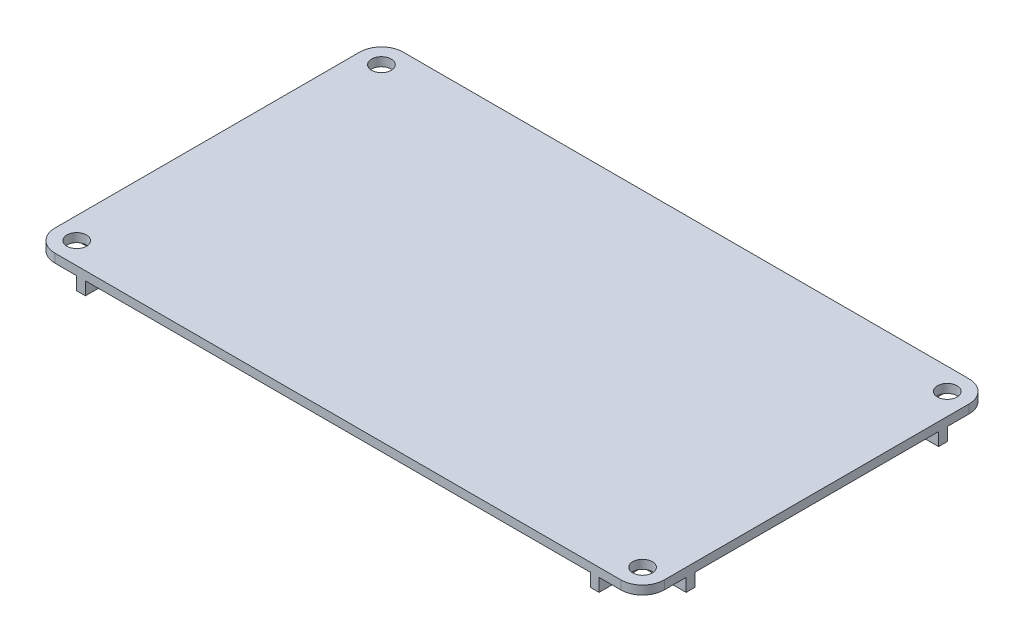
ISO-10303-21;
HEADER;
FILE_DESCRIPTION(('STEP AP214'),'2;1');
FILE_NAME('part.step','',(''),(''),'','','');
FILE_SCHEMA(('AUTOMOTIVE_DESIGN { 1 0 10303 214 1 1 1 1 }'));
ENDSEC;
DATA;
#1=APPLICATION_CONTEXT('core data for automotive mechanical design processes');
#2=APPLICATION_PROTOCOL_DEFINITION('international standard','automotive_design',2000,#1);
#3=PRODUCT_CONTEXT('',#1,'mechanical');
#4=PRODUCT('Part','Part','',(#3));
#5=PRODUCT_RELATED_PRODUCT_CATEGORY('part','',(#4));
#6=PRODUCT_DEFINITION_FORMATION('','',#4);
#7=PRODUCT_DEFINITION_CONTEXT('part definition',#1,'design');
#8=PRODUCT_DEFINITION('design','',#6,#7);
#9=PRODUCT_DEFINITION_SHAPE('','',#8);
#10=(LENGTH_UNIT() NAMED_UNIT(*) SI_UNIT(.MILLI.,.METRE.));
#11=(NAMED_UNIT(*) PLANE_ANGLE_UNIT() SI_UNIT($,.RADIAN.));
#12=(NAMED_UNIT(*) SI_UNIT($,.STERADIAN.) SOLID_ANGLE_UNIT());
#13=UNCERTAINTY_MEASURE_WITH_UNIT(LENGTH_MEASURE(1.E-05),#10,'distance_accuracy_value','');
#14=(GEOMETRIC_REPRESENTATION_CONTEXT(3) GLOBAL_UNCERTAINTY_ASSIGNED_CONTEXT((#13)) GLOBAL_UNIT_ASSIGNED_CONTEXT((#10,
#11,#12)) REPRESENTATION_CONTEXT('',''));
#15=CARTESIAN_POINT('',(0.,0.,0.));
#16=DIRECTION('',(0.,0.,1.));
#17=DIRECTION('',(1.,0.,0.));
#18=AXIS2_PLACEMENT_3D('',#15,#16,#17);
#19=CARTESIAN_POINT('',(0.,0.,0.));
#20=DIRECTION('',(0.,1.,0.));
#21=DIRECTION('',(0.,0.,1.));
#22=AXIS2_PLACEMENT_3D('',#19,#20,#21);
#23=PLANE('',#22);
#24=CARTESIAN_POINT('',(-65.,0.,-35.));
#25=DIRECTION('',(0.,1.,0.));
#26=DIRECTION('',(0.,0.,1.));
#27=AXIS2_PLACEMENT_3D('',#24,#25,#26);
#28=CIRCLE('',#27,2.25);
#29=CARTESIAN_POINT('',(-65.,0.,-32.75));
#30=VERTEX_POINT('',#29);
#31=EDGE_CURVE('E467',#30,#30,#28,.F.);
#32=ORIENTED_EDGE('',*,*,#31,.F.);
#33=EDGE_LOOP('',(#32));
#34=FACE_BOUND('',#33,.T.);
#35=DIRECTION('',(0.,0.,1.));
#36=VECTOR('',#35,1.);
#37=CARTESIAN_POINT('',(-70.,0.,0.));
#38=LINE('',#37,#36);
#39=CARTESIAN_POINT('',(-70.,0.,-35.));
#40=VERTEX_POINT('',#39);
#41=CARTESIAN_POINT('',(-70.,0.,-30.));
#42=VERTEX_POINT('',#41);
#43=EDGE_CURVE('E252',#40,#42,#38,.T.);
#44=ORIENTED_EDGE('',*,*,#43,.F.);
#45=CARTESIAN_POINT('',(-65.,0.,-35.));
#46=DIRECTION('',(0.,1.,0.));
#47=DIRECTION('',(0.,0.,1.));
#48=AXIS2_PLACEMENT_3D('',#45,#46,#47);
#49=CIRCLE('',#48,5.);
#50=CARTESIAN_POINT('',(-65.,0.,-40.));
#51=VERTEX_POINT('',#50);
#52=EDGE_CURVE('E498',#40,#51,#49,.F.);
#53=ORIENTED_EDGE('',*,*,#52,.T.);
#54=DIRECTION('',(1.,0.,0.));
#55=VECTOR('',#54,1.);
#56=CARTESIAN_POINT('',(0.,0.,-40.));
#57=LINE('',#56,#55);
#58=CARTESIAN_POINT('',(-60.,0.,-40.));
#59=VERTEX_POINT('',#58);
#60=EDGE_CURVE('E454',#51,#59,#57,.T.);
#61=ORIENTED_EDGE('',*,*,#60,.T.);
#62=DIRECTION('',(0.,0.,-1.));
#63=VECTOR('',#62,1.);
#64=CARTESIAN_POINT('',(-60.,0.,0.));
#65=LINE('',#64,#63);
#66=CARTESIAN_POINT('',(-60.,0.,-30.));
#67=VERTEX_POINT('',#66);
#68=EDGE_CURVE('E265',#67,#59,#65,.T.);
#69=ORIENTED_EDGE('',*,*,#68,.F.);
#70=DIRECTION('',(1.,0.,0.));
#71=VECTOR('',#70,1.);
#72=CARTESIAN_POINT('',(0.,0.,-30.));
#73=LINE('',#72,#71);
#74=EDGE_CURVE('E279',#42,#67,#73,.T.);
#75=ORIENTED_EDGE('',*,*,#74,.F.);
#76=EDGE_LOOP('',(#44,#53,#61,#69,#75));
#77=FACE_BOUND('',#76,.T.);
#78=ADVANCED_FACE('F35',(#34,#77),#23,.F.);
#79=DIRECTION('',(0.,0.,1.));
#80=VECTOR('',#79,1.);
#81=CARTESIAN_POINT('',(-58.,0.,0.));
#82=LINE('',#81,#80);
#83=CARTESIAN_POINT('',(-58.,0.,-40.));
#84=VERTEX_POINT('',#83);
#85=CARTESIAN_POINT('',(-58.,0.,-28.));
#86=VERTEX_POINT('',#85);
#87=EDGE_CURVE('E283',#84,#86,#82,.T.);
#88=ORIENTED_EDGE('',*,*,#87,.F.);
#89=CARTESIAN_POINT('',(58.,0.,-40.));
#90=VERTEX_POINT('',#89);
#91=EDGE_CURVE('E457',#84,#90,#57,.T.);
#92=ORIENTED_EDGE('',*,*,#91,.T.);
#93=DIRECTION('',(0.,0.,1.));
#94=VECTOR('',#93,1.);
#95=CARTESIAN_POINT('',(58.,0.,0.));
#96=LINE('',#95,#94);
#97=CARTESIAN_POINT('',(58.,0.,-28.));
#98=VERTEX_POINT('',#97);
#99=EDGE_CURVE('E288',#90,#98,#96,.T.);
#100=ORIENTED_EDGE('',*,*,#99,.T.);
#101=DIRECTION('',(1.,0.,0.));
#102=VECTOR('',#101,1.);
#103=CARTESIAN_POINT('',(0.,0.,-28.));
#104=LINE('',#103,#102);
#105=CARTESIAN_POINT('',(70.,0.,-28.));
#106=VERTEX_POINT('',#105);
#107=EDGE_CURVE('E317',#98,#106,#104,.T.);
#108=ORIENTED_EDGE('',*,*,#107,.T.);
#109=DIRECTION('',(0.,0.,1.));
#110=VECTOR('',#109,1.);
#111=CARTESIAN_POINT('',(70.,0.,0.));
#112=LINE('',#111,#110);
#113=CARTESIAN_POINT('',(70.,0.,28.));
#114=VERTEX_POINT('',#113);
#115=EDGE_CURVE('E453',#106,#114,#112,.T.);
#116=ORIENTED_EDGE('',*,*,#115,.T.);
#117=DIRECTION('',(1.,0.,0.));
#118=VECTOR('',#117,1.);
#119=CARTESIAN_POINT('',(0.,0.,28.));
#120=LINE('',#119,#118);
#121=CARTESIAN_POINT('',(58.,0.,28.));
#122=VERTEX_POINT('',#121);
#123=EDGE_CURVE('E359',#122,#114,#120,.T.);
#124=ORIENTED_EDGE('',*,*,#123,.F.);
#125=DIRECTION('',(0.,0.,-1.));
#126=VECTOR('',#125,1.);
#127=CARTESIAN_POINT('',(58.,0.,0.));
#128=LINE('',#127,#126);
#129=CARTESIAN_POINT('',(58.,0.,40.));
#130=VERTEX_POINT('',#129);
#131=EDGE_CURVE('E362',#130,#122,#128,.T.);
#132=ORIENTED_EDGE('',*,*,#131,.F.);
#133=DIRECTION('',(1.,0.,0.));
#134=VECTOR('',#133,1.);
#135=CARTESIAN_POINT('',(0.,0.,40.));
#136=LINE('',#135,#134);
#137=CARTESIAN_POINT('',(-58.,0.,40.));
#138=VERTEX_POINT('',#137);
#139=EDGE_CURVE('E464',#138,#130,#136,.T.);
#140=ORIENTED_EDGE('',*,*,#139,.F.);
#141=DIRECTION('',(0.,0.,-1.));
#142=VECTOR('',#141,1.);
#143=CARTESIAN_POINT('',(-58.,0.,0.));
#144=LINE('',#143,#142);
#145=CARTESIAN_POINT('',(-58.,0.,28.));
#146=VERTEX_POINT('',#145);
#147=EDGE_CURVE('E367',#138,#146,#144,.T.);
#148=ORIENTED_EDGE('',*,*,#147,.T.);
#149=DIRECTION('',(-1.,0.,0.));
#150=VECTOR('',#149,1.);
#151=CARTESIAN_POINT('',(0.,0.,28.));
#152=LINE('',#151,#150);
#153=CARTESIAN_POINT('',(-70.,0.,28.));
#154=VERTEX_POINT('',#153);
#155=EDGE_CURVE('E402',#146,#154,#152,.T.);
#156=ORIENTED_EDGE('',*,*,#155,.T.);
#157=CARTESIAN_POINT('',(-70.,0.,-28.));
#158=VERTEX_POINT('',#157);
#159=EDGE_CURVE('E460',#158,#154,#38,.T.);
#160=ORIENTED_EDGE('',*,*,#159,.F.);
#161=DIRECTION('',(-1.,0.,0.));
#162=VECTOR('',#161,1.);
#163=CARTESIAN_POINT('',(0.,0.,-28.));
#164=LINE('',#163,#162);
#165=EDGE_CURVE('E281',#86,#158,#164,.T.);
#166=ORIENTED_EDGE('',*,*,#165,.F.);
#167=EDGE_LOOP('',(#88,#92,#100,#108,#116,#124,#132,#140,#148,#156,#160,#166));
#168=FACE_BOUND('',#167,.T.);
#169=ADVANCED_FACE('F560',(#168),#23,.F.);
#170=CARTESIAN_POINT('',(65.,0.,-35.));
#171=DIRECTION('',(0.,1.,0.));
#172=DIRECTION('',(0.,0.,1.));
#173=AXIS2_PLACEMENT_3D('',#170,#171,#172);
#174=CIRCLE('',#173,2.25);
#175=CARTESIAN_POINT('',(65.,0.,-32.75));
#176=VERTEX_POINT('',#175);
#177=EDGE_CURVE('E470',#176,#176,#174,.T.);
#178=ORIENTED_EDGE('',*,*,#177,.T.);
#179=EDGE_LOOP('',(#178));
#180=FACE_BOUND('',#179,.T.);
#181=CARTESIAN_POINT('',(60.,0.,-40.));
#182=VERTEX_POINT('',#181);
#183=CARTESIAN_POINT('',(65.,0.,-40.));
#184=VERTEX_POINT('',#183);
#185=EDGE_CURVE('E452',#182,#184,#57,.T.);
#186=ORIENTED_EDGE('',*,*,#185,.T.);
#187=CARTESIAN_POINT('',(65.,0.,-35.));
#188=DIRECTION('',(0.,1.,0.));
#189=DIRECTION('',(0.,0.,1.));
#190=AXIS2_PLACEMENT_3D('',#187,#188,#189);
#191=CIRCLE('',#190,5.);
#192=CARTESIAN_POINT('',(70.,0.,-35.));
#193=VERTEX_POINT('',#192);
#194=EDGE_CURVE('E479',#184,#193,#191,.F.);
#195=ORIENTED_EDGE('',*,*,#194,.T.);
#196=CARTESIAN_POINT('',(70.,0.,-30.));
#197=VERTEX_POINT('',#196);
#198=EDGE_CURVE('E450',#193,#197,#112,.T.);
#199=ORIENTED_EDGE('',*,*,#198,.T.);
#200=DIRECTION('',(-1.,0.,0.));
#201=VECTOR('',#200,1.);
#202=CARTESIAN_POINT('',(0.,0.,-30.));
#203=LINE('',#202,#201);
#204=CARTESIAN_POINT('',(60.,0.,-30.));
#205=VERTEX_POINT('',#204);
#206=EDGE_CURVE('E319',#197,#205,#203,.T.);
#207=ORIENTED_EDGE('',*,*,#206,.T.);
#208=DIRECTION('',(0.,0.,-1.));
#209=VECTOR('',#208,1.);
#210=CARTESIAN_POINT('',(60.,0.,0.));
#211=LINE('',#210,#209);
#212=EDGE_CURVE('E302',#205,#182,#211,.T.);
#213=ORIENTED_EDGE('',*,*,#212,.T.);
#214=EDGE_LOOP('',(#186,#195,#199,#207,#213));
#215=FACE_BOUND('',#214,.T.);
#216=ADVANCED_FACE('F625',(#180,#215),#23,.F.);
#217=CARTESIAN_POINT('',(65.,0.,35.));
#218=DIRECTION('',(0.,1.,0.));
#219=DIRECTION('',(0.,0.,1.));
#220=AXIS2_PLACEMENT_3D('',#217,#218,#219);
#221=CIRCLE('',#220,2.25);
#222=CARTESIAN_POINT('',(65.,0.,37.25));
#223=VERTEX_POINT('',#222);
#224=EDGE_CURVE('E428',#223,#223,#221,.F.);
#225=ORIENTED_EDGE('',*,*,#224,.F.);
#226=EDGE_LOOP('',(#225));
#227=FACE_BOUND('',#226,.T.);
#228=CARTESIAN_POINT('',(70.,0.,30.));
#229=VERTEX_POINT('',#228);
#230=CARTESIAN_POINT('',(70.,0.,35.));
#231=VERTEX_POINT('',#230);
#232=EDGE_CURVE('E412',#229,#231,#112,.T.);
#233=ORIENTED_EDGE('',*,*,#232,.T.);
#234=CARTESIAN_POINT('',(65.,0.,35.));
#235=DIRECTION('',(0.,1.,0.));
#236=DIRECTION('',(0.,0.,1.));
#237=AXIS2_PLACEMENT_3D('',#234,#235,#236);
#238=CIRCLE('',#237,5.);
#239=CARTESIAN_POINT('',(65.,0.,40.));
#240=VERTEX_POINT('',#239);
#241=EDGE_CURVE('E11',#231,#240,#238,.F.);
#242=ORIENTED_EDGE('',*,*,#241,.T.);
#243=CARTESIAN_POINT('',(60.,0.,40.));
#244=VERTEX_POINT('',#243);
#245=EDGE_CURVE('E459',#244,#240,#136,.T.);
#246=ORIENTED_EDGE('',*,*,#245,.F.);
#247=DIRECTION('',(0.,0.,1.));
#248=VECTOR('',#247,1.);
#249=CARTESIAN_POINT('',(60.,0.,0.));
#250=LINE('',#249,#248);
#251=CARTESIAN_POINT('',(60.,0.,30.));
#252=VERTEX_POINT('',#251);
#253=EDGE_CURVE('E345',#252,#244,#250,.T.);
#254=ORIENTED_EDGE('',*,*,#253,.F.);
#255=DIRECTION('',(-1.,0.,0.));
#256=VECTOR('',#255,1.);
#257=CARTESIAN_POINT('',(0.,0.,30.));
#258=LINE('',#257,#256);
#259=EDGE_CURVE('E326',#229,#252,#258,.T.);
#260=ORIENTED_EDGE('',*,*,#259,.F.);
#261=EDGE_LOOP('',(#233,#242,#246,#254,#260));
#262=FACE_BOUND('',#261,.T.);
#263=ADVANCED_FACE('F598',(#227,#262),#23,.F.);
#264=CARTESIAN_POINT('',(70.,2.,0.));
#265=DIRECTION('',(1.,0.,0.));
#266=DIRECTION('',(0.,0.,-1.));
#267=AXIS2_PLACEMENT_3D('',#264,#265,#266);
#268=PLANE('',#267);
#269=ORIENTED_EDGE('',*,*,#198,.F.);
#270=DIRECTION('',(0.,-1.,0.));
#271=VECTOR('',#270,1.);
#272=CARTESIAN_POINT('',(70.,2.,-35.));
#273=LINE('',#272,#271);
#274=CARTESIAN_POINT('',(70.,2.,-35.));
#275=VERTEX_POINT('',#274);
#276=EDGE_CURVE('E484',#193,#275,#273,.F.);
#277=ORIENTED_EDGE('',*,*,#276,.T.);
#278=DIRECTION('',(0.,0.,1.));
#279=VECTOR('',#278,1.);
#280=CARTESIAN_POINT('',(70.,2.,0.));
#281=LINE('',#280,#279);
#282=CARTESIAN_POINT('',(70.,2.,35.));
#283=VERTEX_POINT('',#282);
#284=EDGE_CURVE('E424',#275,#283,#281,.T.);
#285=ORIENTED_EDGE('',*,*,#284,.T.);
#286=DIRECTION('',(0.,-1.,0.));
#287=VECTOR('',#286,1.);
#288=CARTESIAN_POINT('',(70.,0.,35.));
#289=LINE('',#288,#287);
#290=EDGE_CURVE('E481',#283,#231,#289,.T.);
#291=ORIENTED_EDGE('',*,*,#290,.T.);
#292=ORIENTED_EDGE('',*,*,#232,.F.);
#293=DIRECTION('',(0.,1.,0.));
#294=VECTOR('',#293,1.);
#295=CARTESIAN_POINT('',(70.,-3.,30.));
#296=LINE('',#295,#294);
#297=CARTESIAN_POINT('',(70.,-3.,30.));
#298=VERTEX_POINT('',#297);
#299=EDGE_CURVE('E356',#298,#229,#296,.T.);
#300=ORIENTED_EDGE('',*,*,#299,.F.);
#301=DIRECTION('',(0.,0.,1.));
#302=VECTOR('',#301,1.);
#303=CARTESIAN_POINT('',(70.,-3.,0.));
#304=LINE('',#303,#302);
#305=CARTESIAN_POINT('',(70.,-3.,28.));
#306=VERTEX_POINT('',#305);
#307=EDGE_CURVE('E344',#306,#298,#304,.T.);
#308=ORIENTED_EDGE('',*,*,#307,.F.);
#309=DIRECTION('',(0.,1.,0.));
#310=VECTOR('',#309,1.);
#311=CARTESIAN_POINT('',(70.,-3.,28.));
#312=LINE('',#311,#310);
#313=EDGE_CURVE('E376',#306,#114,#312,.T.);
#314=ORIENTED_EDGE('',*,*,#313,.T.);
#315=ORIENTED_EDGE('',*,*,#115,.F.);
#316=DIRECTION('',(0.,1.,0.));
#317=VECTOR('',#316,1.);
#318=CARTESIAN_POINT('',(70.,-3.,-28.));
#319=LINE('',#318,#317);
#320=CARTESIAN_POINT('',(70.,-3.,-28.));
#321=VERTEX_POINT('',#320);
#322=EDGE_CURVE('E336',#321,#106,#319,.T.);
#323=ORIENTED_EDGE('',*,*,#322,.F.);
#324=DIRECTION('',(0.,0.,1.));
#325=VECTOR('',#324,1.);
#326=CARTESIAN_POINT('',(70.,-3.,0.));
#327=LINE('',#326,#325);
#328=CARTESIAN_POINT('',(70.,-3.,-30.));
#329=VERTEX_POINT('',#328);
#330=EDGE_CURVE('E305',#329,#321,#327,.T.);
#331=ORIENTED_EDGE('',*,*,#330,.F.);
#332=DIRECTION('',(0.,1.,0.));
#333=VECTOR('',#332,1.);
#334=CARTESIAN_POINT('',(70.,-3.,-30.));
#335=LINE('',#334,#333);
#336=EDGE_CURVE('E333',#329,#197,#335,.T.);
#337=ORIENTED_EDGE('',*,*,#336,.T.);
#338=EDGE_LOOP('',(#269,#277,#285,#291,#292,#300,#308,#314,#315,#323,#331,#337));
#339=FACE_BOUND('',#338,.T.);
#340=ADVANCED_FACE('F526',(#339),#268,.T.);
#341=CARTESIAN_POINT('',(0.,2.,-40.));
#342=DIRECTION('',(0.,0.,-1.));
#343=DIRECTION('',(-1.,0.,0.));
#344=AXIS2_PLACEMENT_3D('',#341,#342,#343);
#345=PLANE('',#344);
#346=DIRECTION('',(1.,0.,0.));
#347=VECTOR('',#346,1.);
#348=CARTESIAN_POINT('',(0.,2.,-40.));
#349=LINE('',#348,#347);
#350=CARTESIAN_POINT('',(-65.,2.,-40.));
#351=VERTEX_POINT('',#350);
#352=CARTESIAN_POINT('',(65.,2.,-40.));
#353=VERTEX_POINT('',#352);
#354=EDGE_CURVE('E427',#351,#353,#349,.T.);
#355=ORIENTED_EDGE('',*,*,#354,.T.);
#356=DIRECTION('',(0.,-1.,0.));
#357=VECTOR('',#356,1.);
#358=CARTESIAN_POINT('',(65.,2.,-40.));
#359=LINE('',#358,#357);
#360=EDGE_CURVE('E476',#353,#184,#359,.T.);
#361=ORIENTED_EDGE('',*,*,#360,.T.);
#362=ORIENTED_EDGE('',*,*,#185,.F.);
#363=DIRECTION('',(0.,1.,0.));
#364=VECTOR('',#363,1.);
#365=CARTESIAN_POINT('',(60.,-3.,-40.));
#366=LINE('',#365,#364);
#367=CARTESIAN_POINT('',(60.,-3.,-40.));
#368=VERTEX_POINT('',#367);
#369=EDGE_CURVE('E327',#368,#182,#366,.T.);
#370=ORIENTED_EDGE('',*,*,#369,.F.);
#371=DIRECTION('',(1.,0.,0.));
#372=VECTOR('',#371,1.);
#373=CARTESIAN_POINT('',(0.,-3.,-40.));
#374=LINE('',#373,#372);
#375=CARTESIAN_POINT('',(58.,-3.,-40.));
#376=VERTEX_POINT('',#375);
#377=EDGE_CURVE('E313',#376,#368,#374,.T.);
#378=ORIENTED_EDGE('',*,*,#377,.F.);
#379=DIRECTION('',(0.,1.,0.));
#380=VECTOR('',#379,1.);
#381=CARTESIAN_POINT('',(58.,-3.,-40.));
#382=LINE('',#381,#380);
#383=EDGE_CURVE('E323',#376,#90,#382,.T.);
#384=ORIENTED_EDGE('',*,*,#383,.T.);
#385=ORIENTED_EDGE('',*,*,#91,.F.);
#386=DIRECTION('',(0.,1.,0.));
#387=VECTOR('',#386,1.);
#388=CARTESIAN_POINT('',(-58.,-3.,-40.));
#389=LINE('',#388,#387);
#390=CARTESIAN_POINT('',(-58.,-3.,-40.));
#391=VERTEX_POINT('',#390);
#392=EDGE_CURVE('E292',#391,#84,#389,.T.);
#393=ORIENTED_EDGE('',*,*,#392,.F.);
#394=DIRECTION('',(1.,0.,0.));
#395=VECTOR('',#394,1.);
#396=CARTESIAN_POINT('',(0.,-3.,-40.));
#397=LINE('',#396,#395);
#398=CARTESIAN_POINT('',(-60.,-3.,-40.));
#399=VERTEX_POINT('',#398);
#400=EDGE_CURVE('E276',#399,#391,#397,.T.);
#401=ORIENTED_EDGE('',*,*,#400,.F.);
#402=DIRECTION('',(0.,1.,0.));
#403=VECTOR('',#402,1.);
#404=CARTESIAN_POINT('',(-60.,-3.,-40.));
#405=LINE('',#404,#403);
#406=EDGE_CURVE('E289',#399,#59,#405,.T.);
#407=ORIENTED_EDGE('',*,*,#406,.T.);
#408=ORIENTED_EDGE('',*,*,#60,.F.);
#409=DIRECTION('',(0.,-1.,0.));
#410=VECTOR('',#409,1.);
#411=CARTESIAN_POINT('',(-65.,2.,-40.));
#412=LINE('',#411,#410);
#413=EDGE_CURVE('E449',#51,#351,#412,.F.);
#414=ORIENTED_EDGE('',*,*,#413,.T.);
#415=EDGE_LOOP('',(#355,#361,#362,#370,#378,#384,#385,#393,#401,#407,#408,#414));
#416=FACE_BOUND('',#415,.T.);
#417=ADVANCED_FACE('F535',(#416),#345,.T.);
#418=CARTESIAN_POINT('',(-70.,2.,0.));
#419=DIRECTION('',(1.,0.,0.));
#420=DIRECTION('',(0.,0.,-1.));
#421=AXIS2_PLACEMENT_3D('',#418,#419,#420);
#422=PLANE('',#421);
#423=DIRECTION('',(0.,0.,1.));
#424=VECTOR('',#423,1.);
#425=CARTESIAN_POINT('',(-70.,2.,0.));
#426=LINE('',#425,#424);
#427=CARTESIAN_POINT('',(-70.,2.,-35.));
#428=VERTEX_POINT('',#427);
#429=CARTESIAN_POINT('',(-70.,2.,35.));
#430=VERTEX_POINT('',#429);
#431=EDGE_CURVE('E431',#428,#430,#426,.T.);
#432=ORIENTED_EDGE('',*,*,#431,.F.);
#433=DIRECTION('',(0.,-1.,0.));
#434=VECTOR('',#433,1.);
#435=CARTESIAN_POINT('',(-70.,0.,-35.));
#436=LINE('',#435,#434);
#437=EDGE_CURVE('E496',#428,#40,#436,.T.);
#438=ORIENTED_EDGE('',*,*,#437,.T.);
#439=ORIENTED_EDGE('',*,*,#43,.T.);
#440=DIRECTION('',(0.,1.,0.));
#441=VECTOR('',#440,1.);
#442=CARTESIAN_POINT('',(-70.,-3.,-30.));
#443=LINE('',#442,#441);
#444=CARTESIAN_POINT('',(-70.,-3.,-30.));
#445=VERTEX_POINT('',#444);
#446=EDGE_CURVE('E243',#445,#42,#443,.T.);
#447=ORIENTED_EDGE('',*,*,#446,.F.);
#448=DIRECTION('',(0.,0.,1.));
#449=VECTOR('',#448,1.);
#450=CARTESIAN_POINT('',(-70.,-3.,0.));
#451=LINE('',#450,#449);
#452=CARTESIAN_POINT('',(-70.,-3.,-28.));
#453=VERTEX_POINT('',#452);
#454=EDGE_CURVE('E249',#445,#453,#451,.T.);
#455=ORIENTED_EDGE('',*,*,#454,.T.);
#456=DIRECTION('',(0.,1.,0.));
#457=VECTOR('',#456,1.);
#458=CARTESIAN_POINT('',(-70.,-3.,-28.));
#459=LINE('',#458,#457);
#460=EDGE_CURVE('E256',#453,#158,#459,.T.);
#461=ORIENTED_EDGE('',*,*,#460,.T.);
#462=ORIENTED_EDGE('',*,*,#159,.T.);
#463=DIRECTION('',(0.,1.,0.));
#464=VECTOR('',#463,1.);
#465=CARTESIAN_POINT('',(-70.,-3.,28.));
#466=LINE('',#465,#464);
#467=CARTESIAN_POINT('',(-70.,-3.,28.));
#468=VERTEX_POINT('',#467);
#469=EDGE_CURVE('E420',#468,#154,#466,.T.);
#470=ORIENTED_EDGE('',*,*,#469,.F.);
#471=DIRECTION('',(0.,0.,1.));
#472=VECTOR('',#471,1.);
#473=CARTESIAN_POINT('',(-70.,-3.,0.));
#474=LINE('',#473,#472);
#475=CARTESIAN_POINT('',(-70.,-3.,30.));
#476=VERTEX_POINT('',#475);
#477=EDGE_CURVE('E387',#468,#476,#474,.T.);
#478=ORIENTED_EDGE('',*,*,#477,.T.);
#479=DIRECTION('',(0.,1.,0.));
#480=VECTOR('',#479,1.);
#481=CARTESIAN_POINT('',(-70.,-3.,30.));
#482=LINE('',#481,#480);
#483=CARTESIAN_POINT('',(-70.,0.,30.));
#484=VERTEX_POINT('',#483);
#485=EDGE_CURVE('E418',#476,#484,#482,.T.);
#486=ORIENTED_EDGE('',*,*,#485,.T.);
#487=CARTESIAN_POINT('',(-70.,0.,35.));
#488=VERTEX_POINT('',#487);
#489=EDGE_CURVE('E456',#484,#488,#38,.T.);
#490=ORIENTED_EDGE('',*,*,#489,.T.);
#491=DIRECTION('',(0.,-1.,0.));
#492=VECTOR('',#491,1.);
#493=CARTESIAN_POINT('',(-70.,2.,35.));
#494=LINE('',#493,#492);
#495=EDGE_CURVE('E494',#488,#430,#494,.F.);
#496=ORIENTED_EDGE('',*,*,#495,.T.);
#497=EDGE_LOOP('',(#432,#438,#439,#447,#455,#461,#462,#470,#478,#486,#490,#496));
#498=FACE_BOUND('',#497,.T.);
#499=ADVANCED_FACE('F246',(#498),#422,.F.);
#500=CARTESIAN_POINT('',(65.,2.,-35.));
#501=DIRECTION('',(0.,-1.,0.));
#502=DIRECTION('',(0.,0.,-1.));
#503=AXIS2_PLACEMENT_3D('',#500,#501,#502);
#504=CYLINDRICAL_SURFACE('',#503,2.25);
#505=CARTESIAN_POINT('',(65.,2.,-35.));
#506=DIRECTION('',(0.,1.,0.));
#507=DIRECTION('',(0.,0.,1.));
#508=AXIS2_PLACEMENT_3D('',#505,#506,#507);
#509=CIRCLE('',#508,2.25);
#510=CARTESIAN_POINT('',(65.,2.,-32.75));
#511=VERTEX_POINT('',#510);
#512=EDGE_CURVE('E443',#511,#511,#509,.T.);
#513=ORIENTED_EDGE('',*,*,#512,.T.);
#514=EDGE_LOOP('',(#513));
#515=FACE_BOUND('',#514,.T.);
#516=ORIENTED_EDGE('',*,*,#177,.F.);
#517=EDGE_LOOP('',(#516));
#518=FACE_BOUND('',#517,.T.);
#519=ADVANCED_FACE('F655',(#515,#518),#504,.F.);
#520=CARTESIAN_POINT('',(-65.,2.,-35.));
#521=DIRECTION('',(0.,-1.,0.));
#522=DIRECTION('',(0.,0.,-1.));
#523=AXIS2_PLACEMENT_3D('',#520,#521,#522);
#524=CYLINDRICAL_SURFACE('',#523,2.25);
#525=CARTESIAN_POINT('',(-65.,2.,-35.));
#526=DIRECTION('',(0.,1.,0.));
#527=DIRECTION('',(0.,0.,1.));
#528=AXIS2_PLACEMENT_3D('',#525,#526,#527);
#529=CIRCLE('',#528,2.25);
#530=CARTESIAN_POINT('',(-65.,2.,-32.75));
#531=VERTEX_POINT('',#530);
#532=EDGE_CURVE('E440',#531,#531,#529,.F.);
#533=ORIENTED_EDGE('',*,*,#532,.F.);
#534=EDGE_LOOP('',(#533));
#535=FACE_BOUND('',#534,.T.);
#536=ORIENTED_EDGE('',*,*,#31,.T.);
#537=EDGE_LOOP('',(#536));
#538=FACE_BOUND('',#537,.T.);
#539=ADVANCED_FACE('F658',(#535,#538),#524,.F.);
#540=CARTESIAN_POINT('',(-65.,2.,35.));
#541=DIRECTION('',(0.,-1.,0.));
#542=DIRECTION('',(0.,0.,-1.));
#543=AXIS2_PLACEMENT_3D('',#540,#541,#542);
#544=CYLINDRICAL_SURFACE('',#543,2.25);
#545=CARTESIAN_POINT('',(-65.,2.,35.));
#546=DIRECTION('',(0.,1.,0.));
#547=DIRECTION('',(0.,0.,1.));
#548=AXIS2_PLACEMENT_3D('',#545,#546,#547);
#549=CIRCLE('',#548,2.25);
#550=CARTESIAN_POINT('',(-65.,2.,37.25));
#551=VERTEX_POINT('',#550);
#552=EDGE_CURVE('E437',#551,#551,#549,.T.);
#553=ORIENTED_EDGE('',*,*,#552,.T.);
#554=EDGE_LOOP('',(#553));
#555=FACE_BOUND('',#554,.T.);
#556=CARTESIAN_POINT('',(-65.,0.,35.));
#557=DIRECTION('',(0.,1.,0.));
#558=DIRECTION('',(0.,0.,1.));
#559=AXIS2_PLACEMENT_3D('',#556,#557,#558);
#560=CIRCLE('',#559,2.25);
#561=CARTESIAN_POINT('',(-65.,0.,37.25));
#562=VERTEX_POINT('',#561);
#563=EDGE_CURVE('E463',#562,#562,#560,.T.);
#564=ORIENTED_EDGE('',*,*,#563,.F.);
#565=EDGE_LOOP('',(#564));
#566=FACE_BOUND('',#565,.T.);
#567=ADVANCED_FACE('F651',(#555,#566),#544,.F.);
#568=CARTESIAN_POINT('',(0.,2.,40.));
#569=DIRECTION('',(0.,0.,-1.));
#570=DIRECTION('',(-1.,0.,0.));
#571=AXIS2_PLACEMENT_3D('',#568,#569,#570);
#572=PLANE('',#571);
#573=DIRECTION('',(1.,0.,0.));
#574=VECTOR('',#573,1.);
#575=CARTESIAN_POINT('',(0.,2.,40.));
#576=LINE('',#575,#574);
#577=CARTESIAN_POINT('',(-65.,2.,40.));
#578=VERTEX_POINT('',#577);
#579=CARTESIAN_POINT('',(65.,2.,40.));
#580=VERTEX_POINT('',#579);
#581=EDGE_CURVE('E434',#578,#580,#576,.T.);
#582=ORIENTED_EDGE('',*,*,#581,.F.);
#583=DIRECTION('',(0.,-1.,0.));
#584=VECTOR('',#583,1.);
#585=CARTESIAN_POINT('',(-65.,2.,40.));
#586=LINE('',#585,#584);
#587=CARTESIAN_POINT('',(-65.,0.,40.));
#588=VERTEX_POINT('',#587);
#589=EDGE_CURVE('E502',#578,#588,#586,.T.);
#590=ORIENTED_EDGE('',*,*,#589,.T.);
#591=CARTESIAN_POINT('',(-60.,0.,40.));
#592=VERTEX_POINT('',#591);
#593=EDGE_CURVE('E461',#588,#592,#136,.T.);
#594=ORIENTED_EDGE('',*,*,#593,.T.);
#595=DIRECTION('',(0.,1.,0.));
#596=VECTOR('',#595,1.);
#597=CARTESIAN_POINT('',(-60.,-3.,40.));
#598=LINE('',#597,#596);
#599=CARTESIAN_POINT('',(-60.,-3.,40.));
#600=VERTEX_POINT('',#599);
#601=EDGE_CURVE('E413',#600,#592,#598,.T.);
#602=ORIENTED_EDGE('',*,*,#601,.F.);
#603=DIRECTION('',(1.,0.,0.));
#604=VECTOR('',#603,1.);
#605=CARTESIAN_POINT('',(0.,-3.,40.));
#606=LINE('',#605,#604);
#607=CARTESIAN_POINT('',(-58.,-3.,40.));
#608=VERTEX_POINT('',#607);
#609=EDGE_CURVE('E396',#600,#608,#606,.T.);
#610=ORIENTED_EDGE('',*,*,#609,.T.);
#611=DIRECTION('',(0.,1.,0.));
#612=VECTOR('',#611,1.);
#613=CARTESIAN_POINT('',(-58.,-3.,40.));
#614=LINE('',#613,#612);
#615=EDGE_CURVE('E410',#608,#138,#614,.T.);
#616=ORIENTED_EDGE('',*,*,#615,.T.);
#617=ORIENTED_EDGE('',*,*,#139,.T.);
#618=DIRECTION('',(0.,1.,0.));
#619=VECTOR('',#618,1.);
#620=CARTESIAN_POINT('',(58.,-3.,40.));
#621=LINE('',#620,#619);
#622=CARTESIAN_POINT('',(58.,-3.,40.));
#623=VERTEX_POINT('',#622);
#624=EDGE_CURVE('E371',#623,#130,#621,.T.);
#625=ORIENTED_EDGE('',*,*,#624,.F.);
#626=DIRECTION('',(1.,0.,0.));
#627=VECTOR('',#626,1.);
#628=CARTESIAN_POINT('',(0.,-3.,40.));
#629=LINE('',#628,#627);
#630=CARTESIAN_POINT('',(60.,-3.,40.));
#631=VERTEX_POINT('',#630);
#632=EDGE_CURVE('E351',#623,#631,#629,.T.);
#633=ORIENTED_EDGE('',*,*,#632,.T.);
#634=DIRECTION('',(0.,1.,0.));
#635=VECTOR('',#634,1.);
#636=CARTESIAN_POINT('',(60.,-3.,40.));
#637=LINE('',#636,#635);
#638=EDGE_CURVE('E368',#631,#244,#637,.T.);
#639=ORIENTED_EDGE('',*,*,#638,.T.);
#640=ORIENTED_EDGE('',*,*,#245,.T.);
#641=DIRECTION('',(0.,-1.,0.));
#642=VECTOR('',#641,1.);
#643=CARTESIAN_POINT('',(65.,2.,40.));
#644=LINE('',#643,#642);
#645=EDGE_CURVE('E500',#240,#580,#644,.F.);
#646=ORIENTED_EDGE('',*,*,#645,.T.);
#647=EDGE_LOOP('',(#582,#590,#594,#602,#610,#616,#617,#625,#633,#639,#640,#646));
#648=FACE_BOUND('',#647,.T.);
#649=ADVANCED_FACE('F519',(#648),#572,.F.);
#650=CARTESIAN_POINT('',(65.,2.,35.));
#651=DIRECTION('',(0.,-1.,0.));
#652=DIRECTION('',(0.,0.,-1.));
#653=AXIS2_PLACEMENT_3D('',#650,#651,#652);
#654=CYLINDRICAL_SURFACE('',#653,2.25);
#655=CARTESIAN_POINT('',(65.,2.,35.));
#656=DIRECTION('',(0.,1.,0.));
#657=DIRECTION('',(0.,0.,1.));
#658=AXIS2_PLACEMENT_3D('',#655,#656,#657);
#659=CIRCLE('',#658,2.25);
#660=CARTESIAN_POINT('',(65.,2.,37.25));
#661=VERTEX_POINT('',#660);
#662=EDGE_CURVE('E446',#661,#661,#659,.F.);
#663=ORIENTED_EDGE('',*,*,#662,.F.);
#664=EDGE_LOOP('',(#663));
#665=FACE_BOUND('',#664,.T.);
#666=ORIENTED_EDGE('',*,*,#224,.T.);
#667=EDGE_LOOP('',(#666));
#668=FACE_BOUND('',#667,.T.);
#669=ADVANCED_FACE('F635',(#665,#668),#654,.F.);
#670=CARTESIAN_POINT('',(0.,2.,0.));
#671=DIRECTION('',(0.,1.,0.));
#672=DIRECTION('',(0.,0.,1.));
#673=AXIS2_PLACEMENT_3D('',#670,#671,#672);
#674=PLANE('',#673);
#675=ORIENTED_EDGE('',*,*,#284,.F.);
#676=CARTESIAN_POINT('',(65.,2.,-35.));
#677=DIRECTION('',(0.,1.,0.));
#678=DIRECTION('',(0.,0.,1.));
#679=AXIS2_PLACEMENT_3D('',#676,#677,#678);
#680=CIRCLE('',#679,5.);
#681=EDGE_CURVE('E492',#275,#353,#680,.T.);
#682=ORIENTED_EDGE('',*,*,#681,.T.);
#683=ORIENTED_EDGE('',*,*,#354,.F.);
#684=CARTESIAN_POINT('',(-65.,2.,-35.));
#685=DIRECTION('',(0.,1.,0.));
#686=DIRECTION('',(0.,0.,1.));
#687=AXIS2_PLACEMENT_3D('',#684,#685,#686);
#688=CIRCLE('',#687,5.);
#689=EDGE_CURVE('E490',#351,#428,#688,.T.);
#690=ORIENTED_EDGE('',*,*,#689,.T.);
#691=ORIENTED_EDGE('',*,*,#431,.T.);
#692=CARTESIAN_POINT('',(-65.,2.,35.));
#693=DIRECTION('',(0.,1.,0.));
#694=DIRECTION('',(0.,0.,1.));
#695=AXIS2_PLACEMENT_3D('',#692,#693,#694);
#696=CIRCLE('',#695,5.);
#697=EDGE_CURVE('E488',#430,#578,#696,.T.);
#698=ORIENTED_EDGE('',*,*,#697,.T.);
#699=ORIENTED_EDGE('',*,*,#581,.T.);
#700=CARTESIAN_POINT('',(65.,2.,35.));
#701=DIRECTION('',(0.,1.,0.));
#702=DIRECTION('',(0.,0.,1.));
#703=AXIS2_PLACEMENT_3D('',#700,#701,#702);
#704=CIRCLE('',#703,5.);
#705=EDGE_CURVE('E486',#580,#283,#704,.T.);
#706=ORIENTED_EDGE('',*,*,#705,.T.);
#707=EDGE_LOOP('',(#675,#682,#683,#690,#691,#698,#699,#706));
#708=FACE_BOUND('',#707,.T.);
#709=ORIENTED_EDGE('',*,*,#552,.F.);
#710=EDGE_LOOP('',(#709));
#711=FACE_BOUND('',#710,.T.);
#712=ORIENTED_EDGE('',*,*,#532,.T.);
#713=EDGE_LOOP('',(#712));
#714=FACE_BOUND('',#713,.T.);
#715=ORIENTED_EDGE('',*,*,#512,.F.);
#716=EDGE_LOOP('',(#715));
#717=FACE_BOUND('',#716,.T.);
#718=ORIENTED_EDGE('',*,*,#662,.T.);
#719=EDGE_LOOP('',(#718));
#720=FACE_BOUND('',#719,.T.);
#721=ADVANCED_FACE('F515',(#708,#711,#714,#717,#720),#674,.T.);
#722=ORIENTED_EDGE('',*,*,#593,.F.);
#723=CARTESIAN_POINT('',(-65.,0.,35.));
#724=DIRECTION('',(0.,1.,0.));
#725=DIRECTION('',(0.,0.,1.));
#726=AXIS2_PLACEMENT_3D('',#723,#724,#725);
#727=CIRCLE('',#726,5.);
#728=EDGE_CURVE('E43',#588,#488,#727,.F.);
#729=ORIENTED_EDGE('',*,*,#728,.T.);
#730=ORIENTED_EDGE('',*,*,#489,.F.);
#731=DIRECTION('',(1.,0.,0.));
#732=VECTOR('',#731,1.);
#733=CARTESIAN_POINT('',(0.,0.,30.));
#734=LINE('',#733,#732);
#735=CARTESIAN_POINT('',(-60.,0.,30.));
#736=VERTEX_POINT('',#735);
#737=EDGE_CURVE('E405',#484,#736,#734,.T.);
#738=ORIENTED_EDGE('',*,*,#737,.T.);
#739=DIRECTION('',(0.,0.,1.));
#740=VECTOR('',#739,1.);
#741=CARTESIAN_POINT('',(-60.,0.,0.));
#742=LINE('',#741,#740);
#743=EDGE_CURVE('E384',#736,#592,#742,.T.);
#744=ORIENTED_EDGE('',*,*,#743,.T.);
#745=EDGE_LOOP('',(#722,#729,#730,#738,#744));
#746=FACE_BOUND('',#745,.T.);
#747=ORIENTED_EDGE('',*,*,#563,.T.);
#748=EDGE_LOOP('',(#747));
#749=FACE_BOUND('',#748,.T.);
#750=ADVANCED_FACE('F507',(#746,#749),#23,.F.);
#751=CARTESIAN_POINT('',(-58.,-3.,0.));
#752=DIRECTION('',(1.,0.,0.));
#753=DIRECTION('',(0.,0.,-1.));
#754=AXIS2_PLACEMENT_3D('',#751,#752,#753);
#755=PLANE('',#754);
#756=ORIENTED_EDGE('',*,*,#147,.F.);
#757=ORIENTED_EDGE('',*,*,#615,.F.);
#758=DIRECTION('',(0.,0.,-1.));
#759=VECTOR('',#758,1.);
#760=CARTESIAN_POINT('',(-58.,-3.,0.));
#761=LINE('',#760,#759);
#762=CARTESIAN_POINT('',(-58.,-3.,28.));
#763=VERTEX_POINT('',#762);
#764=EDGE_CURVE('E380',#608,#763,#761,.T.);
#765=ORIENTED_EDGE('',*,*,#764,.T.);
#766=DIRECTION('',(0.,1.,0.));
#767=VECTOR('',#766,1.);
#768=CARTESIAN_POINT('',(-58.,-3.,28.));
#769=LINE('',#768,#767);
#770=EDGE_CURVE('E399',#763,#146,#769,.T.);
#771=ORIENTED_EDGE('',*,*,#770,.T.);
#772=EDGE_LOOP('',(#756,#757,#765,#771));
#773=FACE_BOUND('',#772,.T.);
#774=ADVANCED_FACE('F581',(#773),#755,.T.);
#775=CARTESIAN_POINT('',(-60.,-3.,0.));
#776=DIRECTION('',(-1.,0.,0.));
#777=DIRECTION('',(0.,0.,1.));
#778=AXIS2_PLACEMENT_3D('',#775,#776,#777);
#779=PLANE('',#778);
#780=ORIENTED_EDGE('',*,*,#743,.F.);
#781=DIRECTION('',(0.,1.,0.));
#782=VECTOR('',#781,1.);
#783=CARTESIAN_POINT('',(-60.,-3.,30.));
#784=LINE('',#783,#782);
#785=CARTESIAN_POINT('',(-60.,-3.,30.));
#786=VERTEX_POINT('',#785);
#787=EDGE_CURVE('E416',#786,#736,#784,.T.);
#788=ORIENTED_EDGE('',*,*,#787,.F.);
#789=DIRECTION('',(0.,0.,1.));
#790=VECTOR('',#789,1.);
#791=CARTESIAN_POINT('',(-60.,-3.,0.));
#792=LINE('',#791,#790);
#793=EDGE_CURVE('E393',#786,#600,#792,.T.);
#794=ORIENTED_EDGE('',*,*,#793,.T.);
#795=ORIENTED_EDGE('',*,*,#601,.T.);
#796=EDGE_LOOP('',(#780,#788,#794,#795));
#797=FACE_BOUND('',#796,.T.);
#798=ADVANCED_FACE('F578',(#797),#779,.T.);
#799=CARTESIAN_POINT('',(0.,-3.,30.));
#800=DIRECTION('',(0.,0.,1.));
#801=DIRECTION('',(1.,0.,0.));
#802=AXIS2_PLACEMENT_3D('',#799,#800,#801);
#803=PLANE('',#802);
#804=ORIENTED_EDGE('',*,*,#737,.F.);
#805=ORIENTED_EDGE('',*,*,#485,.F.);
#806=DIRECTION('',(1.,0.,0.));
#807=VECTOR('',#806,1.);
#808=CARTESIAN_POINT('',(0.,-3.,30.));
#809=LINE('',#808,#807);
#810=EDGE_CURVE('E390',#476,#786,#809,.T.);
#811=ORIENTED_EDGE('',*,*,#810,.T.);
#812=ORIENTED_EDGE('',*,*,#787,.T.);
#813=EDGE_LOOP('',(#804,#805,#811,#812));
#814=FACE_BOUND('',#813,.T.);
#815=ADVANCED_FACE('F575',(#814),#803,.T.);
#816=CARTESIAN_POINT('',(0.,-3.,28.));
#817=DIRECTION('',(0.,0.,-1.));
#818=DIRECTION('',(-1.,0.,0.));
#819=AXIS2_PLACEMENT_3D('',#816,#817,#818);
#820=PLANE('',#819);
#821=ORIENTED_EDGE('',*,*,#155,.F.);
#822=ORIENTED_EDGE('',*,*,#770,.F.);
#823=DIRECTION('',(-1.,0.,0.));
#824=VECTOR('',#823,1.);
#825=CARTESIAN_POINT('',(0.,-3.,28.));
#826=LINE('',#825,#824);
#827=EDGE_CURVE('E383',#763,#468,#826,.T.);
#828=ORIENTED_EDGE('',*,*,#827,.T.);
#829=ORIENTED_EDGE('',*,*,#469,.T.);
#830=EDGE_LOOP('',(#821,#822,#828,#829));
#831=FACE_BOUND('',#830,.T.);
#832=ADVANCED_FACE('F565',(#831),#820,.T.);
#833=CARTESIAN_POINT('',(0.,-3.,0.));
#834=DIRECTION('',(0.,1.,0.));
#835=DIRECTION('',(0.,0.,1.));
#836=AXIS2_PLACEMENT_3D('',#833,#834,#835);
#837=PLANE('',#836);
#838=ORIENTED_EDGE('',*,*,#764,.F.);
#839=ORIENTED_EDGE('',*,*,#609,.F.);
#840=ORIENTED_EDGE('',*,*,#793,.F.);
#841=ORIENTED_EDGE('',*,*,#810,.F.);
#842=ORIENTED_EDGE('',*,*,#477,.F.);
#843=ORIENTED_EDGE('',*,*,#827,.F.);
#844=EDGE_LOOP('',(#838,#839,#840,#841,#842,#843));
#845=FACE_BOUND('',#844,.T.);
#846=ADVANCED_FACE('F571',(#845),#837,.F.);
#847=CARTESIAN_POINT('',(0.,-3.,30.));
#848=DIRECTION('',(0.,0.,-1.));
#849=DIRECTION('',(-1.,0.,0.));
#850=AXIS2_PLACEMENT_3D('',#847,#848,#849);
#851=PLANE('',#850);
#852=ORIENTED_EDGE('',*,*,#259,.T.);
#853=DIRECTION('',(0.,1.,0.));
#854=VECTOR('',#853,1.);
#855=CARTESIAN_POINT('',(60.,-3.,30.));
#856=LINE('',#855,#854);
#857=CARTESIAN_POINT('',(60.,-3.,30.));
#858=VERTEX_POINT('',#857);
#859=EDGE_CURVE('E365',#858,#252,#856,.T.);
#860=ORIENTED_EDGE('',*,*,#859,.F.);
#861=DIRECTION('',(-1.,0.,0.));
#862=VECTOR('',#861,1.);
#863=CARTESIAN_POINT('',(0.,-3.,30.));
#864=LINE('',#863,#862);
#865=EDGE_CURVE('E341',#298,#858,#864,.T.);
#866=ORIENTED_EDGE('',*,*,#865,.F.);
#867=ORIENTED_EDGE('',*,*,#299,.T.);
#868=EDGE_LOOP('',(#852,#860,#866,#867));
#869=FACE_BOUND('',#868,.T.);
#870=ADVANCED_FACE('F871',(#869),#851,.F.);
#871=CARTESIAN_POINT('',(60.,-3.,0.));
#872=DIRECTION('',(-1.,0.,0.));
#873=DIRECTION('',(0.,0.,1.));
#874=AXIS2_PLACEMENT_3D('',#871,#872,#873);
#875=PLANE('',#874);
#876=ORIENTED_EDGE('',*,*,#253,.T.);
#877=ORIENTED_EDGE('',*,*,#638,.F.);
#878=DIRECTION('',(0.,0.,1.));
#879=VECTOR('',#878,1.);
#880=CARTESIAN_POINT('',(60.,-3.,0.));
#881=LINE('',#880,#879);
#882=EDGE_CURVE('E354',#858,#631,#881,.T.);
#883=ORIENTED_EDGE('',*,*,#882,.F.);
#884=ORIENTED_EDGE('',*,*,#859,.T.);
#885=EDGE_LOOP('',(#876,#877,#883,#884));
#886=FACE_BOUND('',#885,.T.);
#887=ADVANCED_FACE('F596',(#886),#875,.F.);
#888=CARTESIAN_POINT('',(58.,-3.,0.));
#889=DIRECTION('',(1.,0.,0.));
#890=DIRECTION('',(0.,0.,-1.));
#891=AXIS2_PLACEMENT_3D('',#888,#889,#890);
#892=PLANE('',#891);
#893=ORIENTED_EDGE('',*,*,#131,.T.);
#894=DIRECTION('',(0.,1.,0.));
#895=VECTOR('',#894,1.);
#896=CARTESIAN_POINT('',(58.,-3.,28.));
#897=LINE('',#896,#895);
#898=CARTESIAN_POINT('',(58.,-3.,28.));
#899=VERTEX_POINT('',#898);
#900=EDGE_CURVE('E373',#899,#122,#897,.T.);
#901=ORIENTED_EDGE('',*,*,#900,.F.);
#902=DIRECTION('',(0.,0.,-1.));
#903=VECTOR('',#902,1.);
#904=CARTESIAN_POINT('',(58.,-3.,0.));
#905=LINE('',#904,#903);
#906=EDGE_CURVE('E349',#623,#899,#905,.T.);
#907=ORIENTED_EDGE('',*,*,#906,.F.);
#908=ORIENTED_EDGE('',*,*,#624,.T.);
#909=EDGE_LOOP('',(#893,#901,#907,#908));
#910=FACE_BOUND('',#909,.T.);
#911=ADVANCED_FACE('F588',(#910),#892,.F.);
#912=CARTESIAN_POINT('',(0.,-3.,28.));
#913=DIRECTION('',(0.,0.,1.));
#914=DIRECTION('',(1.,0.,0.));
#915=AXIS2_PLACEMENT_3D('',#912,#913,#914);
#916=PLANE('',#915);
#917=ORIENTED_EDGE('',*,*,#123,.T.);
#918=ORIENTED_EDGE('',*,*,#313,.F.);
#919=DIRECTION('',(1.,0.,0.));
#920=VECTOR('',#919,1.);
#921=CARTESIAN_POINT('',(0.,-3.,28.));
#922=LINE('',#921,#920);
#923=EDGE_CURVE('E347',#899,#306,#922,.T.);
#924=ORIENTED_EDGE('',*,*,#923,.F.);
#925=ORIENTED_EDGE('',*,*,#900,.T.);
#926=EDGE_LOOP('',(#917,#918,#924,#925));
#927=FACE_BOUND('',#926,.T.);
#928=ADVANCED_FACE('F608',(#927),#916,.F.);
#929=CARTESIAN_POINT('',(0.,-3.,0.));
#930=DIRECTION('',(0.,1.,0.));
#931=DIRECTION('',(0.,0.,1.));
#932=AXIS2_PLACEMENT_3D('',#929,#930,#931);
#933=PLANE('',#932);
#934=ORIENTED_EDGE('',*,*,#865,.T.);
#935=ORIENTED_EDGE('',*,*,#882,.T.);
#936=ORIENTED_EDGE('',*,*,#632,.F.);
#937=ORIENTED_EDGE('',*,*,#906,.T.);
#938=ORIENTED_EDGE('',*,*,#923,.T.);
#939=ORIENTED_EDGE('',*,*,#307,.T.);
#940=EDGE_LOOP('',(#934,#935,#936,#937,#938,#939));
#941=FACE_BOUND('',#940,.T.);
#942=ADVANCED_FACE('F591',(#941),#933,.F.);
#943=CARTESIAN_POINT('',(58.,-3.,0.));
#944=DIRECTION('',(-1.,0.,0.));
#945=DIRECTION('',(0.,0.,1.));
#946=AXIS2_PLACEMENT_3D('',#943,#944,#945);
#947=PLANE('',#946);
#948=ORIENTED_EDGE('',*,*,#99,.F.);
#949=ORIENTED_EDGE('',*,*,#383,.F.);
#950=DIRECTION('',(0.,0.,1.));
#951=VECTOR('',#950,1.);
#952=CARTESIAN_POINT('',(58.,-3.,0.));
#953=LINE('',#952,#951);
#954=CARTESIAN_POINT('',(58.,-3.,-28.));
#955=VERTEX_POINT('',#954);
#956=EDGE_CURVE('E298',#376,#955,#953,.T.);
#957=ORIENTED_EDGE('',*,*,#956,.T.);
#958=DIRECTION('',(0.,1.,0.));
#959=VECTOR('',#958,1.);
#960=CARTESIAN_POINT('',(58.,-3.,-28.));
#961=LINE('',#960,#959);
#962=EDGE_CURVE('E315',#955,#98,#961,.T.);
#963=ORIENTED_EDGE('',*,*,#962,.T.);
#964=EDGE_LOOP('',(#948,#949,#957,#963));
#965=FACE_BOUND('',#964,.T.);
#966=ADVANCED_FACE('F615',(#965),#947,.T.);
#967=CARTESIAN_POINT('',(60.,-3.,0.));
#968=DIRECTION('',(1.,0.,0.));
#969=DIRECTION('',(0.,0.,-1.));
#970=AXIS2_PLACEMENT_3D('',#967,#968,#969);
#971=PLANE('',#970);
#972=ORIENTED_EDGE('',*,*,#212,.F.);
#973=DIRECTION('',(0.,1.,0.));
#974=VECTOR('',#973,1.);
#975=CARTESIAN_POINT('',(60.,-3.,-30.));
#976=LINE('',#975,#974);
#977=CARTESIAN_POINT('',(60.,-3.,-30.));
#978=VERTEX_POINT('',#977);
#979=EDGE_CURVE('E330',#978,#205,#976,.T.);
#980=ORIENTED_EDGE('',*,*,#979,.F.);
#981=DIRECTION('',(0.,0.,-1.));
#982=VECTOR('',#981,1.);
#983=CARTESIAN_POINT('',(60.,-3.,0.));
#984=LINE('',#983,#982);
#985=EDGE_CURVE('E310',#978,#368,#984,.T.);
#986=ORIENTED_EDGE('',*,*,#985,.T.);
#987=ORIENTED_EDGE('',*,*,#369,.T.);
#988=EDGE_LOOP('',(#972,#980,#986,#987));
#989=FACE_BOUND('',#988,.T.);
#990=ADVANCED_FACE('F827',(#989),#971,.T.);
#991=CARTESIAN_POINT('',(0.,-3.,-30.));
#992=DIRECTION('',(0.,0.,-1.));
#993=DIRECTION('',(-1.,0.,0.));
#994=AXIS2_PLACEMENT_3D('',#991,#992,#993);
#995=PLANE('',#994);
#996=ORIENTED_EDGE('',*,*,#206,.F.);
#997=ORIENTED_EDGE('',*,*,#336,.F.);
#998=DIRECTION('',(-1.,0.,0.));
#999=VECTOR('',#998,1.);
#1000=CARTESIAN_POINT('',(0.,-3.,-30.));
#1001=LINE('',#1000,#999);
#1002=EDGE_CURVE('E307',#329,#978,#1001,.T.);
#1003=ORIENTED_EDGE('',*,*,#1002,.T.);
#1004=ORIENTED_EDGE('',*,*,#979,.T.);
#1005=EDGE_LOOP('',(#996,#997,#1003,#1004));
#1006=FACE_BOUND('',#1005,.T.);
#1007=ADVANCED_FACE('F817',(#1006),#995,.T.);
#1008=CARTESIAN_POINT('',(0.,-3.,-28.));
#1009=DIRECTION('',(0.,0.,1.));
#1010=DIRECTION('',(1.,0.,0.));
#1011=AXIS2_PLACEMENT_3D('',#1008,#1009,#1010);
#1012=PLANE('',#1011);
#1013=ORIENTED_EDGE('',*,*,#107,.F.);
#1014=ORIENTED_EDGE('',*,*,#962,.F.);
#1015=DIRECTION('',(1.,0.,0.));
#1016=VECTOR('',#1015,1.);
#1017=CARTESIAN_POINT('',(0.,-3.,-28.));
#1018=LINE('',#1017,#1016);
#1019=EDGE_CURVE('E301',#955,#321,#1018,.T.);
#1020=ORIENTED_EDGE('',*,*,#1019,.T.);
#1021=ORIENTED_EDGE('',*,*,#322,.T.);
#1022=EDGE_LOOP('',(#1013,#1014,#1020,#1021));
#1023=FACE_BOUND('',#1022,.T.);
#1024=ADVANCED_FACE('F807',(#1023),#1012,.T.);
#1025=CARTESIAN_POINT('',(0.,-3.,0.));
#1026=DIRECTION('',(0.,1.,0.));
#1027=DIRECTION('',(0.,0.,1.));
#1028=AXIS2_PLACEMENT_3D('',#1025,#1026,#1027);
#1029=PLANE('',#1028);
#1030=ORIENTED_EDGE('',*,*,#956,.F.);
#1031=ORIENTED_EDGE('',*,*,#377,.T.);
#1032=ORIENTED_EDGE('',*,*,#985,.F.);
#1033=ORIENTED_EDGE('',*,*,#1002,.F.);
#1034=ORIENTED_EDGE('',*,*,#330,.T.);
#1035=ORIENTED_EDGE('',*,*,#1019,.F.);
#1036=EDGE_LOOP('',(#1030,#1031,#1032,#1033,#1034,#1035));
#1037=FACE_BOUND('',#1036,.T.);
#1038=ADVANCED_FACE('F798',(#1037),#1029,.F.);
#1039=CARTESIAN_POINT('',(0.,-3.,-30.));
#1040=DIRECTION('',(0.,0.,1.));
#1041=DIRECTION('',(1.,0.,0.));
#1042=AXIS2_PLACEMENT_3D('',#1039,#1040,#1041);
#1043=PLANE('',#1042);
#1044=ORIENTED_EDGE('',*,*,#74,.T.);
#1045=DIRECTION('',(0.,1.,0.));
#1046=VECTOR('',#1045,1.);
#1047=CARTESIAN_POINT('',(-60.,-3.,-30.));
#1048=LINE('',#1047,#1046);
#1049=CARTESIAN_POINT('',(-60.,-3.,-30.));
#1050=VERTEX_POINT('',#1049);
#1051=EDGE_CURVE('E263',#1050,#67,#1048,.T.);
#1052=ORIENTED_EDGE('',*,*,#1051,.F.);
#1053=DIRECTION('',(1.,0.,0.));
#1054=VECTOR('',#1053,1.);
#1055=CARTESIAN_POINT('',(0.,-3.,-30.));
#1056=LINE('',#1055,#1054);
#1057=EDGE_CURVE('E261',#445,#1050,#1056,.T.);
#1058=ORIENTED_EDGE('',*,*,#1057,.F.);
#1059=ORIENTED_EDGE('',*,*,#446,.T.);
#1060=EDGE_LOOP('',(#1044,#1052,#1058,#1059));
#1061=FACE_BOUND('',#1060,.T.);
#1062=ADVANCED_FACE('F262',(#1061),#1043,.F.);
#1063=CARTESIAN_POINT('',(-60.,-3.,0.));
#1064=DIRECTION('',(1.,0.,0.));
#1065=DIRECTION('',(0.,0.,-1.));
#1066=AXIS2_PLACEMENT_3D('',#1063,#1064,#1065);
#1067=PLANE('',#1066);
#1068=ORIENTED_EDGE('',*,*,#68,.T.);
#1069=ORIENTED_EDGE('',*,*,#406,.F.);
#1070=DIRECTION('',(0.,0.,-1.));
#1071=VECTOR('',#1070,1.);
#1072=CARTESIAN_POINT('',(-60.,-3.,0.));
#1073=LINE('',#1072,#1071);
#1074=EDGE_CURVE('E257',#1050,#399,#1073,.T.);
#1075=ORIENTED_EDGE('',*,*,#1074,.F.);
#1076=ORIENTED_EDGE('',*,*,#1051,.T.);
#1077=EDGE_LOOP('',(#1068,#1069,#1075,#1076));
#1078=FACE_BOUND('',#1077,.T.);
#1079=ADVANCED_FACE('F546',(#1078),#1067,.F.);
#1080=CARTESIAN_POINT('',(-58.,-3.,0.));
#1081=DIRECTION('',(-1.,0.,0.));
#1082=DIRECTION('',(0.,0.,1.));
#1083=AXIS2_PLACEMENT_3D('',#1080,#1081,#1082);
#1084=PLANE('',#1083);
#1085=ORIENTED_EDGE('',*,*,#87,.T.);
#1086=DIRECTION('',(0.,1.,0.));
#1087=VECTOR('',#1086,1.);
#1088=CARTESIAN_POINT('',(-58.,-3.,-28.));
#1089=LINE('',#1088,#1087);
#1090=CARTESIAN_POINT('',(-58.,-3.,-28.));
#1091=VERTEX_POINT('',#1090);
#1092=EDGE_CURVE('E294',#1091,#86,#1089,.T.);
#1093=ORIENTED_EDGE('',*,*,#1092,.F.);
#1094=DIRECTION('',(0.,0.,1.));
#1095=VECTOR('',#1094,1.);
#1096=CARTESIAN_POINT('',(-58.,-3.,0.));
#1097=LINE('',#1096,#1095);
#1098=EDGE_CURVE('E272',#391,#1091,#1097,.T.);
#1099=ORIENTED_EDGE('',*,*,#1098,.F.);
#1100=ORIENTED_EDGE('',*,*,#392,.T.);
#1101=EDGE_LOOP('',(#1085,#1093,#1099,#1100));
#1102=FACE_BOUND('',#1101,.T.);
#1103=ADVANCED_FACE('F553',(#1102),#1084,.F.);
#1104=CARTESIAN_POINT('',(0.,-3.,-28.));
#1105=DIRECTION('',(0.,0.,-1.));
#1106=DIRECTION('',(-1.,0.,0.));
#1107=AXIS2_PLACEMENT_3D('',#1104,#1105,#1106);
#1108=PLANE('',#1107);
#1109=ORIENTED_EDGE('',*,*,#165,.T.);
#1110=ORIENTED_EDGE('',*,*,#460,.F.);
#1111=DIRECTION('',(-1.,0.,0.));
#1112=VECTOR('',#1111,1.);
#1113=CARTESIAN_POINT('',(0.,-3.,-28.));
#1114=LINE('',#1113,#1112);
#1115=EDGE_CURVE('E269',#1091,#453,#1114,.T.);
#1116=ORIENTED_EDGE('',*,*,#1115,.F.);
#1117=ORIENTED_EDGE('',*,*,#1092,.T.);
#1118=EDGE_LOOP('',(#1109,#1110,#1116,#1117));
#1119=FACE_BOUND('',#1118,.T.);
#1120=ADVANCED_FACE('F557',(#1119),#1108,.F.);
#1121=CARTESIAN_POINT('',(0.,-3.,0.));
#1122=DIRECTION('',(0.,1.,0.));
#1123=DIRECTION('',(0.,0.,1.));
#1124=AXIS2_PLACEMENT_3D('',#1121,#1122,#1123);
#1125=PLANE('',#1124);
#1126=ORIENTED_EDGE('',*,*,#1057,.T.);
#1127=ORIENTED_EDGE('',*,*,#1074,.T.);
#1128=ORIENTED_EDGE('',*,*,#400,.T.);
#1129=ORIENTED_EDGE('',*,*,#1098,.T.);
#1130=ORIENTED_EDGE('',*,*,#1115,.T.);
#1131=ORIENTED_EDGE('',*,*,#454,.F.);
#1132=EDGE_LOOP('',(#1126,#1127,#1128,#1129,#1130,#1131));
#1133=FACE_BOUND('',#1132,.T.);
#1134=ADVANCED_FACE('F267',(#1133),#1125,.F.);
#1135=CARTESIAN_POINT('',(65.,2.,-35.));
#1136=DIRECTION('',(0.,-1.,0.));
#1137=DIRECTION('',(0.,0.,-1.));
#1138=AXIS2_PLACEMENT_3D('',#1135,#1136,#1137);
#1139=CYLINDRICAL_SURFACE('',#1138,5.);
#1140=ORIENTED_EDGE('',*,*,#681,.F.);
#1141=ORIENTED_EDGE('',*,*,#276,.F.);
#1142=ORIENTED_EDGE('',*,*,#194,.F.);
#1143=ORIENTED_EDGE('',*,*,#360,.F.);
#1144=EDGE_LOOP('',(#1140,#1141,#1142,#1143));
#1145=FACE_BOUND('',#1144,.T.);
#1146=ADVANCED_FACE('F530',(#1145),#1139,.T.);
#1147=CARTESIAN_POINT('',(-65.,2.,-35.));
#1148=DIRECTION('',(0.,1.,0.));
#1149=DIRECTION('',(0.,0.,1.));
#1150=AXIS2_PLACEMENT_3D('',#1147,#1148,#1149);
#1151=CYLINDRICAL_SURFACE('',#1150,5.);
#1152=ORIENTED_EDGE('',*,*,#689,.F.);
#1153=ORIENTED_EDGE('',*,*,#413,.F.);
#1154=ORIENTED_EDGE('',*,*,#52,.F.);
#1155=ORIENTED_EDGE('',*,*,#437,.F.);
#1156=EDGE_LOOP('',(#1152,#1153,#1154,#1155));
#1157=FACE_BOUND('',#1156,.T.);
#1158=ADVANCED_FACE('F540',(#1157),#1151,.T.);
#1159=CARTESIAN_POINT('',(-65.,2.,35.));
#1160=DIRECTION('',(0.,-1.,0.));
#1161=DIRECTION('',(0.,0.,-1.));
#1162=AXIS2_PLACEMENT_3D('',#1159,#1160,#1161);
#1163=CYLINDRICAL_SURFACE('',#1162,5.);
#1164=ORIENTED_EDGE('',*,*,#697,.F.);
#1165=ORIENTED_EDGE('',*,*,#495,.F.);
#1166=ORIENTED_EDGE('',*,*,#728,.F.);
#1167=ORIENTED_EDGE('',*,*,#589,.F.);
#1168=EDGE_LOOP('',(#1164,#1165,#1166,#1167));
#1169=FACE_BOUND('',#1168,.T.);
#1170=ADVANCED_FACE('F511',(#1169),#1163,.T.);
#1171=CARTESIAN_POINT('',(65.,2.,35.));
#1172=DIRECTION('',(0.,1.,0.));
#1173=DIRECTION('',(0.,0.,1.));
#1174=AXIS2_PLACEMENT_3D('',#1171,#1172,#1173);
#1175=CYLINDRICAL_SURFACE('',#1174,5.);
#1176=ORIENTED_EDGE('',*,*,#705,.F.);
#1177=ORIENTED_EDGE('',*,*,#645,.F.);
#1178=ORIENTED_EDGE('',*,*,#241,.F.);
#1179=ORIENTED_EDGE('',*,*,#290,.F.);
#1180=EDGE_LOOP('',(#1176,#1177,#1178,#1179));
#1181=FACE_BOUND('',#1180,.T.);
#1182=ADVANCED_FACE('F37',(#1181),#1175,.T.);
#1183=CLOSED_SHELL('',(#78,#169,#216,#263,#340,#417,#499,#519,#539,#567,#649,#669,#721,#750,
#774,#798,#815,#832,#846,#870,#887,#911,#928,#942,#966,#990,#1007,#1024,#1038,#1062,#1079,#1103,
#1120,#1134,#1146,#1158,#1170,#1182));
#1184=MANIFOLD_SOLID_BREP('B2',#1183);
#1185=ADVANCED_BREP_SHAPE_REPRESENTATION('',(#18,#1184),#14);
#1186=SHAPE_DEFINITION_REPRESENTATION(#9,#1185);
ENDSEC;
END-ISO-10303-21;
